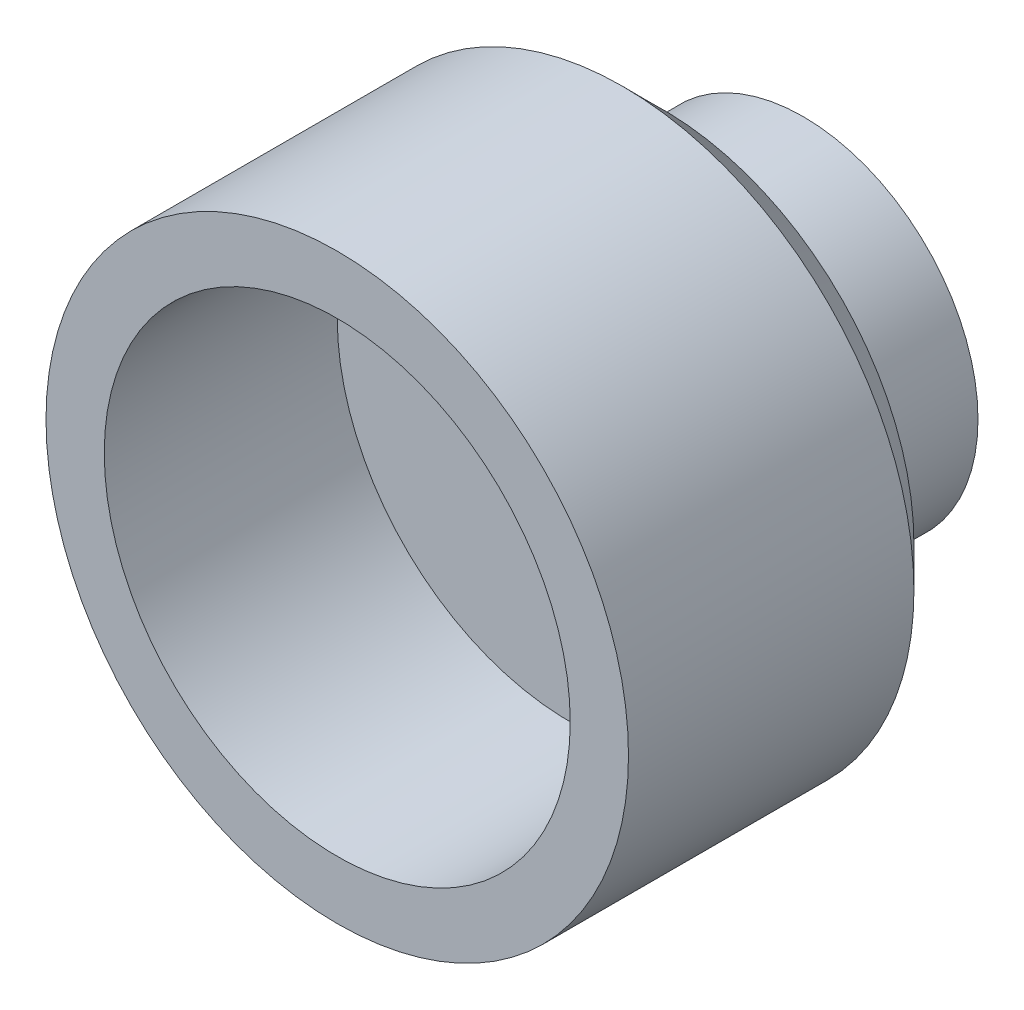
ISO-10303-21;
HEADER;
FILE_DESCRIPTION(('STEP AP214'),'2;1');
FILE_NAME('part.step','',(''),(''),'','','');
FILE_SCHEMA(('AUTOMOTIVE_DESIGN { 1 0 10303 214 1 1 1 1 }'));
ENDSEC;
DATA;
#1=APPLICATION_CONTEXT('core data for automotive mechanical design processes');
#2=APPLICATION_PROTOCOL_DEFINITION('international standard','automotive_design',2000,#1);
#3=PRODUCT_CONTEXT('',#1,'mechanical');
#4=PRODUCT('Part','Part','',(#3));
#5=PRODUCT_RELATED_PRODUCT_CATEGORY('part','',(#4));
#6=PRODUCT_DEFINITION_FORMATION('','',#4);
#7=PRODUCT_DEFINITION_CONTEXT('part definition',#1,'design');
#8=PRODUCT_DEFINITION('design','',#6,#7);
#9=PRODUCT_DEFINITION_SHAPE('','',#8);
#10=(LENGTH_UNIT() NAMED_UNIT(*) SI_UNIT(.MILLI.,.METRE.));
#11=(NAMED_UNIT(*) PLANE_ANGLE_UNIT() SI_UNIT($,.RADIAN.));
#12=(NAMED_UNIT(*) SI_UNIT($,.STERADIAN.) SOLID_ANGLE_UNIT());
#13=UNCERTAINTY_MEASURE_WITH_UNIT(LENGTH_MEASURE(1.E-05),#10,'distance_accuracy_value','');
#14=(GEOMETRIC_REPRESENTATION_CONTEXT(3) GLOBAL_UNCERTAINTY_ASSIGNED_CONTEXT((#13)) GLOBAL_UNIT_ASSIGNED_CONTEXT((#10,
#11,#12)) REPRESENTATION_CONTEXT('',''));
#15=CARTESIAN_POINT('',(0.,0.,0.));
#16=DIRECTION('',(0.,0.,1.));
#17=DIRECTION('',(1.,0.,0.));
#18=AXIS2_PLACEMENT_3D('',#15,#16,#17);
#19=CARTESIAN_POINT('',(0.,2.,0.));
#20=DIRECTION('',(0.,0.,-1.));
#21=DIRECTION('',(-1.,0.,0.));
#22=AXIS2_PLACEMENT_3D('',#19,#20,#21);
#23=PLANE('',#22);
#24=CARTESIAN_POINT('',(0.,0.,0.));
#25=DIRECTION('',(0.,0.,1.));
#26=DIRECTION('',(1.,0.,0.));
#27=AXIS2_PLACEMENT_3D('',#24,#25,#26);
#28=CIRCLE('',#27,2.);
#29=CARTESIAN_POINT('',(2.,0.,0.));
#30=VERTEX_POINT('',#29);
#31=EDGE_CURVE('E63',#30,#30,#28,.T.);
#32=ORIENTED_EDGE('',*,*,#31,.F.);
#33=EDGE_LOOP('',(#32));
#34=FACE_BOUND('',#33,.T.);
#35=CARTESIAN_POINT('',(0.,0.,0.));
#36=DIRECTION('',(0.,0.,1.));
#37=DIRECTION('',(1.,0.,0.));
#38=AXIS2_PLACEMENT_3D('',#35,#36,#37);
#39=CIRCLE('',#38,2.5);
#40=CARTESIAN_POINT('',(2.5,0.,0.));
#41=VERTEX_POINT('',#40);
#42=EDGE_CURVE('E42',#41,#41,#39,.T.);
#43=ORIENTED_EDGE('',*,*,#42,.T.);
#44=EDGE_LOOP('',(#43));
#45=FACE_BOUND('',#44,.T.);
#46=ADVANCED_FACE('F31',(#34,#45),#23,.F.);
#47=CARTESIAN_POINT('',(0.,0.,20.7004155612658));
#48=DIRECTION('',(0.,0.,1.));
#49=DIRECTION('',(1.,0.,0.));
#50=AXIS2_PLACEMENT_3D('',#47,#48,#49);
#51=CYLINDRICAL_SURFACE('',#50,2.5);
#52=CARTESIAN_POINT('',(0.,0.,-2.45));
#53=DIRECTION('',(0.,0.,1.));
#54=DIRECTION('',(1.,0.,0.));
#55=AXIS2_PLACEMENT_3D('',#52,#53,#54);
#56=CIRCLE('',#55,2.5);
#57=CARTESIAN_POINT('',(2.5,0.,-2.45));
#58=VERTEX_POINT('',#57);
#59=EDGE_CURVE('E38',#58,#58,#56,.T.);
#60=ORIENTED_EDGE('',*,*,#59,.T.);
#61=EDGE_LOOP('',(#60));
#62=FACE_BOUND('',#61,.T.);
#63=ORIENTED_EDGE('',*,*,#42,.F.);
#64=EDGE_LOOP('',(#63));
#65=FACE_BOUND('',#64,.T.);
#66=ADVANCED_FACE('F71',(#62,#65),#51,.T.);
#67=CARTESIAN_POINT('',(0.,2.5,-2.8));
#68=DIRECTION('',(0.,0.,1.));
#69=DIRECTION('',(1.,0.,0.));
#70=AXIS2_PLACEMENT_3D('',#67,#68,#69);
#71=PLANE('',#70);
#72=CARTESIAN_POINT('',(0.,0.,-2.8));
#73=DIRECTION('',(0.,0.,1.));
#74=DIRECTION('',(1.,0.,0.));
#75=AXIS2_PLACEMENT_3D('',#72,#73,#74);
#76=CIRCLE('',#75,2.15);
#77=CARTESIAN_POINT('',(2.15,0.,-2.8));
#78=VERTEX_POINT('',#77);
#79=EDGE_CURVE('E10',#78,#78,#76,.F.);
#80=ORIENTED_EDGE('',*,*,#79,.T.);
#81=EDGE_LOOP('',(#80));
#82=FACE_BOUND('',#81,.T.);
#83=CARTESIAN_POINT('',(0.,0.,-2.8));
#84=DIRECTION('',(0.,0.,1.));
#85=DIRECTION('',(1.,0.,0.));
#86=AXIS2_PLACEMENT_3D('',#83,#84,#85);
#87=CIRCLE('',#86,1.5);
#88=CARTESIAN_POINT('',(1.5,0.,-2.8));
#89=VERTEX_POINT('',#88);
#90=EDGE_CURVE('E46',#89,#89,#87,.T.);
#91=ORIENTED_EDGE('',*,*,#90,.T.);
#92=EDGE_LOOP('',(#91));
#93=FACE_BOUND('',#92,.T.);
#94=ADVANCED_FACE('F75',(#82,#93),#71,.F.);
#95=CARTESIAN_POINT('',(0.,0.,20.7004155612658));
#96=DIRECTION('',(0.,0.,1.));
#97=DIRECTION('',(1.,0.,0.));
#98=AXIS2_PLACEMENT_3D('',#95,#96,#97);
#99=CYLINDRICAL_SURFACE('',#98,1.5);
#100=ORIENTED_EDGE('',*,*,#90,.F.);
#101=EDGE_LOOP('',(#100));
#102=FACE_BOUND('',#101,.T.);
#103=CARTESIAN_POINT('',(0.,0.,-4.));
#104=DIRECTION('',(0.,0.,1.));
#105=DIRECTION('',(1.,0.,0.));
#106=AXIS2_PLACEMENT_3D('',#103,#104,#105);
#107=CIRCLE('',#106,1.5);
#108=CARTESIAN_POINT('',(1.5,0.,-4.));
#109=VERTEX_POINT('',#108);
#110=EDGE_CURVE('E51',#109,#109,#107,.T.);
#111=ORIENTED_EDGE('',*,*,#110,.T.);
#112=EDGE_LOOP('',(#111));
#113=FACE_BOUND('',#112,.T.);
#114=ADVANCED_FACE('F80',(#102,#113),#99,.T.);
#115=CARTESIAN_POINT('',(0.,1.5,-4.));
#116=DIRECTION('',(0.,0.,1.));
#117=DIRECTION('',(1.,0.,0.));
#118=AXIS2_PLACEMENT_3D('',#115,#116,#117);
#119=PLANE('',#118);
#120=ORIENTED_EDGE('',*,*,#110,.F.);
#121=EDGE_LOOP('',(#120));
#122=FACE_BOUND('',#121,.T.);
#123=CARTESIAN_POINT('',(0.,0.,-4.));
#124=DIRECTION('',(0.,0.,1.));
#125=DIRECTION('',(1.,0.,0.));
#126=AXIS2_PLACEMENT_3D('',#123,#124,#125);
#127=CIRCLE('',#126,0.5);
#128=CARTESIAN_POINT('',(0.5,0.,-4.));
#129=VERTEX_POINT('',#128);
#130=EDGE_CURVE('E54',#129,#129,#127,.T.);
#131=ORIENTED_EDGE('',*,*,#130,.T.);
#132=EDGE_LOOP('',(#131));
#133=FACE_BOUND('',#132,.T.);
#134=ADVANCED_FACE('F85',(#122,#133),#119,.F.);
#135=CARTESIAN_POINT('',(0.,0.,20.7004155612658));
#136=DIRECTION('',(0.,0.,1.));
#137=DIRECTION('',(1.,0.,0.));
#138=AXIS2_PLACEMENT_3D('',#135,#136,#137);
#139=CYLINDRICAL_SURFACE('',#138,0.5);
#140=ORIENTED_EDGE('',*,*,#130,.F.);
#141=EDGE_LOOP('',(#140));
#142=FACE_BOUND('',#141,.T.);
#143=CARTESIAN_POINT('',(0.,0.,-2.));
#144=DIRECTION('',(0.,0.,1.));
#145=DIRECTION('',(1.,0.,0.));
#146=AXIS2_PLACEMENT_3D('',#143,#144,#145);
#147=CIRCLE('',#146,0.5);
#148=CARTESIAN_POINT('',(0.5,0.,-2.));
#149=VERTEX_POINT('',#148);
#150=EDGE_CURVE('E57',#149,#149,#147,.T.);
#151=ORIENTED_EDGE('',*,*,#150,.T.);
#152=EDGE_LOOP('',(#151));
#153=FACE_BOUND('',#152,.T.);
#154=ADVANCED_FACE('F89',(#142,#153),#139,.F.);
#155=CARTESIAN_POINT('',(0.,0.5,-2.));
#156=DIRECTION('',(0.,0.,-1.));
#157=DIRECTION('',(-1.,0.,0.));
#158=AXIS2_PLACEMENT_3D('',#155,#156,#157);
#159=PLANE('',#158);
#160=ORIENTED_EDGE('',*,*,#150,.F.);
#161=EDGE_LOOP('',(#160));
#162=FACE_BOUND('',#161,.T.);
#163=CARTESIAN_POINT('',(0.,0.,-2.));
#164=DIRECTION('',(0.,0.,1.));
#165=DIRECTION('',(1.,0.,0.));
#166=AXIS2_PLACEMENT_3D('',#163,#164,#165);
#167=CIRCLE('',#166,2.);
#168=CARTESIAN_POINT('',(2.,0.,-2.));
#169=VERTEX_POINT('',#168);
#170=EDGE_CURVE('E60',#169,#169,#167,.T.);
#171=ORIENTED_EDGE('',*,*,#170,.T.);
#172=EDGE_LOOP('',(#171));
#173=FACE_BOUND('',#172,.T.);
#174=ADVANCED_FACE('F93',(#162,#173),#159,.F.);
#175=CARTESIAN_POINT('',(0.,0.,20.7004155612658));
#176=DIRECTION('',(0.,0.,1.));
#177=DIRECTION('',(1.,0.,0.));
#178=AXIS2_PLACEMENT_3D('',#175,#176,#177);
#179=CYLINDRICAL_SURFACE('',#178,2.);
#180=ORIENTED_EDGE('',*,*,#170,.F.);
#181=EDGE_LOOP('',(#180));
#182=FACE_BOUND('',#181,.T.);
#183=ORIENTED_EDGE('',*,*,#31,.T.);
#184=EDGE_LOOP('',(#183));
#185=FACE_BOUND('',#184,.T.);
#186=ADVANCED_FACE('F67',(#182,#185),#179,.F.);
#187=CARTESIAN_POINT('',(0.,0.,-2.45));
#188=DIRECTION('',(0.,0.,1.));
#189=DIRECTION('',(1.,0.,0.));
#190=AXIS2_PLACEMENT_3D('',#187,#188,#189);
#191=CONICAL_SURFACE('',#190,2.5,0.785398163397451);
#192=CARTESIAN_POINT('',(2.15,0.,-2.8));
#193=CARTESIAN_POINT('',(2.15364583333333,0.,-2.79635416666667));
#194=CARTESIAN_POINT('',(2.15729166666667,0.,-2.79270833333333));
#195=CARTESIAN_POINT('',(2.16458333333333,0.,-2.78541666666667));
#196=CARTESIAN_POINT('',(2.16822916666667,0.,-2.78177083333333));
#197=CARTESIAN_POINT('',(2.17552083333333,0.,-2.77447916666667));
#198=CARTESIAN_POINT('',(2.17916666666667,0.,-2.77083333333333));
#199=CARTESIAN_POINT('',(2.18645833333333,0.,-2.76354166666667));
#200=CARTESIAN_POINT('',(2.19010416666667,0.,-2.75989583333333));
#201=CARTESIAN_POINT('',(2.19739583333333,0.,-2.75260416666667));
#202=CARTESIAN_POINT('',(2.20104166666667,0.,-2.74895833333333));
#203=CARTESIAN_POINT('',(2.20833333333333,0.,-2.74166666666667));
#204=CARTESIAN_POINT('',(2.21197916666667,0.,-2.73802083333333));
#205=CARTESIAN_POINT('',(2.21927083333333,0.,-2.73072916666667));
#206=CARTESIAN_POINT('',(2.22291666666667,0.,-2.72708333333333));
#207=CARTESIAN_POINT('',(2.23020833333333,0.,-2.71979166666667));
#208=CARTESIAN_POINT('',(2.23385416666667,0.,-2.71614583333333));
#209=CARTESIAN_POINT('',(2.24114583333333,0.,-2.70885416666667));
#210=CARTESIAN_POINT('',(2.24479166666667,0.,-2.70520833333333));
#211=CARTESIAN_POINT('',(2.25208333333333,0.,-2.69791666666667));
#212=CARTESIAN_POINT('',(2.25572916666667,0.,-2.69427083333333));
#213=CARTESIAN_POINT('',(2.26302083333333,0.,-2.68697916666667));
#214=CARTESIAN_POINT('',(2.26666666666667,0.,-2.68333333333333));
#215=CARTESIAN_POINT('',(2.27395833333333,0.,-2.67604166666667));
#216=CARTESIAN_POINT('',(2.27760416666667,0.,-2.67239583333333));
#217=CARTESIAN_POINT('',(2.28489583333333,0.,-2.66510416666667));
#218=CARTESIAN_POINT('',(2.28854166666667,0.,-2.66145833333333));
#219=CARTESIAN_POINT('',(2.29583333333333,0.,-2.65416666666667));
#220=CARTESIAN_POINT('',(2.29947916666667,0.,-2.65052083333333));
#221=CARTESIAN_POINT('',(2.30677083333333,0.,-2.64322916666667));
#222=CARTESIAN_POINT('',(2.31041666666667,0.,-2.63958333333333));
#223=CARTESIAN_POINT('',(2.31770833333333,0.,-2.63229166666667));
#224=CARTESIAN_POINT('',(2.32135416666667,0.,-2.62864583333333));
#225=CARTESIAN_POINT('',(2.32864583333333,0.,-2.62135416666667));
#226=CARTESIAN_POINT('',(2.33229166666667,0.,-2.61770833333333));
#227=CARTESIAN_POINT('',(2.33958333333333,0.,-2.61041666666667));
#228=CARTESIAN_POINT('',(2.34322916666667,0.,-2.60677083333333));
#229=CARTESIAN_POINT('',(2.35052083333333,0.,-2.59947916666667));
#230=CARTESIAN_POINT('',(2.35416666666667,0.,-2.59583333333333));
#231=CARTESIAN_POINT('',(2.36145833333333,0.,-2.58854166666667));
#232=CARTESIAN_POINT('',(2.36510416666667,0.,-2.58489583333333));
#233=CARTESIAN_POINT('',(2.37239583333333,0.,-2.57760416666667));
#234=CARTESIAN_POINT('',(2.37604166666667,0.,-2.57395833333333));
#235=CARTESIAN_POINT('',(2.38333333333333,0.,-2.56666666666667));
#236=CARTESIAN_POINT('',(2.38697916666667,0.,-2.56302083333333));
#237=CARTESIAN_POINT('',(2.39427083333333,0.,-2.55572916666667));
#238=CARTESIAN_POINT('',(2.39791666666667,0.,-2.55208333333333));
#239=CARTESIAN_POINT('',(2.40520833333333,0.,-2.54479166666667));
#240=CARTESIAN_POINT('',(2.40885416666667,0.,-2.54114583333333));
#241=CARTESIAN_POINT('',(2.41614583333333,0.,-2.53385416666667));
#242=CARTESIAN_POINT('',(2.41979166666667,0.,-2.53020833333333));
#243=CARTESIAN_POINT('',(2.42708333333333,0.,-2.52291666666667));
#244=CARTESIAN_POINT('',(2.43072916666667,0.,-2.51927083333333));
#245=CARTESIAN_POINT('',(2.43802083333333,0.,-2.51197916666667));
#246=CARTESIAN_POINT('',(2.44166666666667,0.,-2.50833333333333));
#247=CARTESIAN_POINT('',(2.44895833333333,0.,-2.50104166666667));
#248=CARTESIAN_POINT('',(2.45260416666667,0.,-2.49739583333333));
#249=CARTESIAN_POINT('',(2.45989583333333,0.,-2.49010416666667));
#250=CARTESIAN_POINT('',(2.46354166666667,0.,-2.48645833333333));
#251=CARTESIAN_POINT('',(2.47083333333333,0.,-2.47916666666667));
#252=CARTESIAN_POINT('',(2.47447916666667,0.,-2.47552083333333));
#253=CARTESIAN_POINT('',(2.48177083333333,0.,-2.46822916666667));
#254=CARTESIAN_POINT('',(2.48541666666667,0.,-2.46458333333333));
#255=CARTESIAN_POINT('',(2.49270833333333,0.,-2.45729166666667));
#256=CARTESIAN_POINT('',(2.49635416666667,0.,-2.45364583333333));
#257=CARTESIAN_POINT('',(2.5,0.,-2.45));
#258=B_SPLINE_CURVE_WITH_KNOTS('',3,(#192,#193,#194,#195,#196,#197,#198,#199,#200,#201,#202,
#203,#204,#205,#206,#207,#208,#209,#210,#211,#212,#213,#214,#215,#216,#217,#218,#219,#220,#221,
#222,#223,#224,#225,#226,#227,#228,#229,#230,#231,#232,#233,#234,#235,#236,#237,#238,#239,#240,
#241,#242,#243,#244,#245,#246,#247,#248,#249,#250,#251,#252,#253,#254,#255,#256,#257),
.UNSPECIFIED.,.F.,.F.,(4,2,2,2,2,2,2,2,2,2,2,2,2,2,2,2,2,2,2,2,2,2,2,2,2,2,2,2,2,2,2,2,4),(0.,
0.0154679608384556,0.0309359216769114,0.0464038825153673,0.0618718433538231,0.0773398041922787,
0.0928077650307346,0.10827572586919,0.123743686707646,0.139211647546102,0.154679608384557,
0.170147569223013,0.185615530061469,0.201083490899925,0.21655145173838,0.232019412576836,
0.247487373415292,0.262955334253748,0.278423295092203,0.293891255930659,0.309359216769114,
0.32482717760757,0.340295138446026,0.355763099284482,0.371231060122938,0.386699020961393,
0.402166981799849,0.417634942638305,0.43310290347676,0.448570864315216,0.464038825153672,
0.479506785992128,0.494974746830583),.UNSPECIFIED.);
#259=EDGE_CURVE('BSEAM33',#78,#58,#258,.T.);
#260=ORIENTED_EDGE('',*,*,#79,.F.);
#261=ORIENTED_EDGE('',*,*,#59,.F.);
#262=ORIENTED_EDGE('',*,*,#259,.T.);
#263=ORIENTED_EDGE('',*,*,#259,.F.);
#264=EDGE_LOOP('',(#260,#262,#261,#263));
#265=FACE_BOUND('',#264,.T.);
#266=ADVANCED_FACE('F33',(#265),#191,.T.);
#267=CLOSED_SHELL('',(#46,#66,#94,#114,#134,#154,#174,#186,#266));
#268=MANIFOLD_SOLID_BREP('B2',#267);
#269=ADVANCED_BREP_SHAPE_REPRESENTATION('',(#18,#268),#14);
#270=SHAPE_DEFINITION_REPRESENTATION(#9,#269);
ENDSEC;
END-ISO-10303-21;
